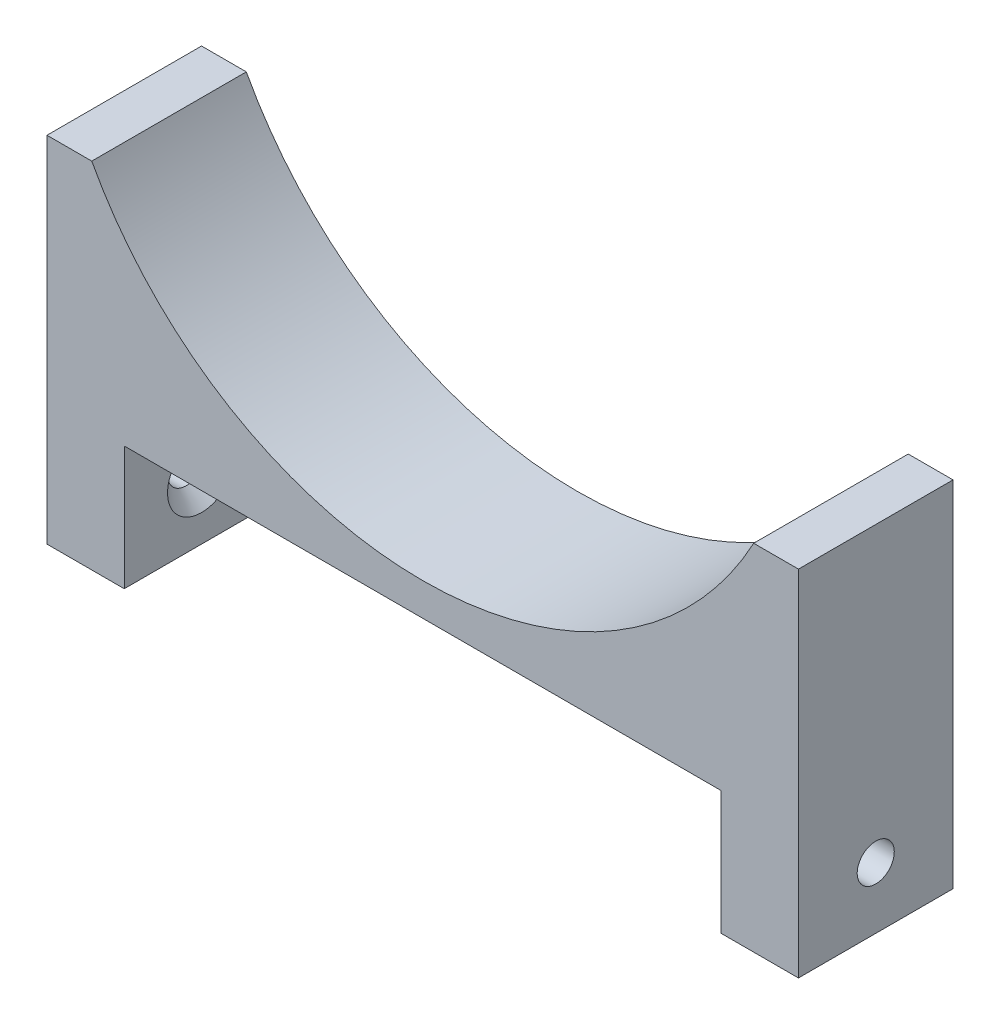
ISO-10303-21;
HEADER;
FILE_DESCRIPTION(('STEP AP214'),'2;1');
FILE_NAME('part.step','',(''),(''),'','','');
FILE_SCHEMA(('AUTOMOTIVE_DESIGN { 1 0 10303 214 1 1 1 1 }'));
ENDSEC;
DATA;
#1=APPLICATION_CONTEXT('core data for automotive mechanical design processes');
#2=APPLICATION_PROTOCOL_DEFINITION('international standard','automotive_design',2000,#1);
#3=PRODUCT_CONTEXT('',#1,'mechanical');
#4=PRODUCT('Part','Part','',(#3));
#5=PRODUCT_RELATED_PRODUCT_CATEGORY('part','',(#4));
#6=PRODUCT_DEFINITION_FORMATION('','',#4);
#7=PRODUCT_DEFINITION_CONTEXT('part definition',#1,'design');
#8=PRODUCT_DEFINITION('design','',#6,#7);
#9=PRODUCT_DEFINITION_SHAPE('','',#8);
#10=(LENGTH_UNIT() NAMED_UNIT(*) SI_UNIT(.MILLI.,.METRE.));
#11=(NAMED_UNIT(*) PLANE_ANGLE_UNIT() SI_UNIT($,.RADIAN.));
#12=(NAMED_UNIT(*) SI_UNIT($,.STERADIAN.) SOLID_ANGLE_UNIT());
#13=UNCERTAINTY_MEASURE_WITH_UNIT(LENGTH_MEASURE(1.E-05),#10,'distance_accuracy_value','');
#14=(GEOMETRIC_REPRESENTATION_CONTEXT(3) GLOBAL_UNCERTAINTY_ASSIGNED_CONTEXT((#13)) GLOBAL_UNIT_ASSIGNED_CONTEXT((#10,
#11,#12)) REPRESENTATION_CONTEXT('',''));
#15=CARTESIAN_POINT('',(0.,0.,0.));
#16=DIRECTION('',(0.,0.,1.));
#17=DIRECTION('',(1.,0.,0.));
#18=AXIS2_PLACEMENT_3D('',#15,#16,#17);
#19=CARTESIAN_POINT('',(0.,-13.2695636207256,10.));
#20=DIRECTION('',(0.,1.,0.));
#21=DIRECTION('',(0.,0.,1.));
#22=AXIS2_PLACEMENT_3D('',#19,#20,#21);
#23=PLANE('',#22);
#24=DIRECTION('',(1.,0.,0.));
#25=VECTOR('',#24,1.);
#26=CARTESIAN_POINT('',(0.,-13.2695636207256,0.));
#27=LINE('',#26,#25);
#28=CARTESIAN_POINT('',(-4.7093762726953,-13.2695636207256,0.));
#29=VERTEX_POINT('',#28);
#30=CARTESIAN_POINT('',(33.9106237273047,-13.2695636207256,0.));
#31=VERTEX_POINT('',#30);
#32=EDGE_CURVE('E161',#29,#31,#27,.T.);
#33=ORIENTED_EDGE('',*,*,#32,.T.);
#34=DIRECTION('',(0.,0.,-1.));
#35=VECTOR('',#34,1.);
#36=CARTESIAN_POINT('',(33.9106237273047,-13.2695636207256,10.));
#37=LINE('',#36,#35);
#38=CARTESIAN_POINT('',(33.9106237273047,-13.2695636207256,10.));
#39=VERTEX_POINT('',#38);
#40=EDGE_CURVE('E11',#39,#31,#37,.T.);
#41=ORIENTED_EDGE('',*,*,#40,.F.);
#42=DIRECTION('',(1.,0.,0.));
#43=VECTOR('',#42,1.);
#44=CARTESIAN_POINT('',(0.,-13.2695636207256,10.));
#45=LINE('',#44,#43);
#46=CARTESIAN_POINT('',(-4.7093762726953,-13.2695636207256,10.));
#47=VERTEX_POINT('',#46);
#48=EDGE_CURVE('E192',#47,#39,#45,.T.);
#49=ORIENTED_EDGE('',*,*,#48,.F.);
#50=DIRECTION('',(0.,0.,-1.));
#51=VECTOR('',#50,1.);
#52=CARTESIAN_POINT('',(-4.7093762726953,-13.2695636207256,10.));
#53=LINE('',#52,#51);
#54=EDGE_CURVE('E157',#47,#29,#53,.T.);
#55=ORIENTED_EDGE('',*,*,#54,.T.);
#56=EDGE_LOOP('',(#33,#41,#49,#55));
#57=FACE_BOUND('',#56,.T.);
#58=ADVANCED_FACE('F45',(#57),#23,.F.);
#59=CARTESIAN_POINT('',(33.9106237273047,0.,10.));
#60=DIRECTION('',(1.,0.,0.));
#61=DIRECTION('',(0.,1.,0.));
#62=AXIS2_PLACEMENT_3D('',#59,#60,#61);
#63=PLANE('',#62);
#64=CARTESIAN_POINT('',(33.9106237273047,-17.3014069741831,5.));
#65=DIRECTION('',(-1.,0.,0.));
#66=DIRECTION('',(0.,0.,1.));
#67=AXIS2_PLACEMENT_3D('',#64,#65,#66);
#68=CIRCLE('',#67,2.2);
#69=CARTESIAN_POINT('',(33.9106237273047,-17.3014069741831,7.2));
#70=VERTEX_POINT('',#69);
#71=EDGE_CURVE('E305',#70,#70,#68,.T.);
#72=ORIENTED_EDGE('',*,*,#71,.F.);
#73=EDGE_LOOP('',(#72));
#74=FACE_BOUND('',#73,.T.);
#75=DIRECTION('',(0.,-1.,0.));
#76=VECTOR('',#75,1.);
#77=CARTESIAN_POINT('',(33.9106237273047,0.,0.));
#78=LINE('',#77,#76);
#79=CARTESIAN_POINT('',(33.9106237273047,-21.2695636207256,0.));
#80=VERTEX_POINT('',#79);
#81=EDGE_CURVE('E165',#31,#80,#78,.T.);
#82=ORIENTED_EDGE('',*,*,#81,.T.);
#83=DIRECTION('',(0.,0.,-1.));
#84=VECTOR('',#83,1.);
#85=CARTESIAN_POINT('',(33.9106237273047,-21.2695636207256,10.));
#86=LINE('',#85,#84);
#87=CARTESIAN_POINT('',(33.9106237273047,-21.2695636207256,10.));
#88=VERTEX_POINT('',#87);
#89=EDGE_CURVE('E55',#88,#80,#86,.T.);
#90=ORIENTED_EDGE('',*,*,#89,.F.);
#91=DIRECTION('',(0.,-1.,0.));
#92=VECTOR('',#91,1.);
#93=CARTESIAN_POINT('',(33.9106237273047,0.,10.));
#94=LINE('',#93,#92);
#95=EDGE_CURVE('E113',#39,#88,#94,.T.);
#96=ORIENTED_EDGE('',*,*,#95,.F.);
#97=ORIENTED_EDGE('',*,*,#40,.T.);
#98=EDGE_LOOP('',(#82,#90,#96,#97));
#99=FACE_BOUND('',#98,.T.);
#100=ADVANCED_FACE('F274',(#74,#99),#63,.F.);
#101=CARTESIAN_POINT('',(0.,-21.2695636207256,10.));
#102=DIRECTION('',(0.,1.,0.));
#103=DIRECTION('',(0.,0.,1.));
#104=AXIS2_PLACEMENT_3D('',#101,#102,#103);
#105=PLANE('',#104);
#106=DIRECTION('',(1.,0.,0.));
#107=VECTOR('',#106,1.);
#108=CARTESIAN_POINT('',(0.,-21.2695636207256,0.));
#109=LINE('',#108,#107);
#110=CARTESIAN_POINT('',(38.9106237273047,-21.2695636207256,0.));
#111=VERTEX_POINT('',#110);
#112=EDGE_CURVE('E169',#80,#111,#109,.T.);
#113=ORIENTED_EDGE('',*,*,#112,.T.);
#114=DIRECTION('',(0.,0.,-1.));
#115=VECTOR('',#114,1.);
#116=CARTESIAN_POINT('',(38.9106237273047,-21.2695636207256,10.));
#117=LINE('',#116,#115);
#118=CARTESIAN_POINT('',(38.9106237273047,-21.2695636207256,10.));
#119=VERTEX_POINT('',#118);
#120=EDGE_CURVE('E209',#119,#111,#117,.T.);
#121=ORIENTED_EDGE('',*,*,#120,.F.);
#122=DIRECTION('',(1.,0.,0.));
#123=VECTOR('',#122,1.);
#124=CARTESIAN_POINT('',(0.,-21.2695636207256,10.));
#125=LINE('',#124,#123);
#126=EDGE_CURVE('E235',#88,#119,#125,.T.);
#127=ORIENTED_EDGE('',*,*,#126,.F.);
#128=ORIENTED_EDGE('',*,*,#89,.T.);
#129=EDGE_LOOP('',(#113,#121,#127,#128));
#130=FACE_BOUND('',#129,.T.);
#131=ADVANCED_FACE('F279',(#130),#105,.F.);
#132=CARTESIAN_POINT('',(38.9106237273047,0.,10.));
#133=DIRECTION('',(-1.,0.,0.));
#134=DIRECTION('',(0.,-1.,0.));
#135=AXIS2_PLACEMENT_3D('',#132,#133,#134);
#136=PLANE('',#135);
#137=CARTESIAN_POINT('',(38.9106237273047,-17.3014069741831,5.));
#138=DIRECTION('',(-1.,0.,0.));
#139=DIRECTION('',(0.,-1.,0.));
#140=AXIS2_PLACEMENT_3D('',#137,#138,#139);
#141=CIRCLE('',#140,1.19999999999999);
#142=CARTESIAN_POINT('',(38.9106237273047,-18.5014069741831,5.));
#143=VERTEX_POINT('',#142);
#144=EDGE_CURVE('E48',#143,#143,#141,.T.);
#145=ORIENTED_EDGE('',*,*,#144,.T.);
#146=EDGE_LOOP('',(#145));
#147=FACE_BOUND('',#146,.T.);
#148=DIRECTION('',(0.,1.,0.));
#149=VECTOR('',#148,1.);
#150=CARTESIAN_POINT('',(38.9106237273047,0.,0.));
#151=LINE('',#150,#149);
#152=CARTESIAN_POINT('',(38.9106237273047,1.64143290609947,0.));
#153=VERTEX_POINT('',#152);
#154=EDGE_CURVE('E172',#111,#153,#151,.T.);
#155=ORIENTED_EDGE('',*,*,#154,.T.);
#156=DIRECTION('',(0.,0.,-1.));
#157=VECTOR('',#156,1.);
#158=CARTESIAN_POINT('',(38.9106237273047,1.64143290609947,10.));
#159=LINE('',#158,#157);
#160=CARTESIAN_POINT('',(38.9106237273047,1.64143290609947,10.));
#161=VERTEX_POINT('',#160);
#162=EDGE_CURVE('E205',#161,#153,#159,.T.);
#163=ORIENTED_EDGE('',*,*,#162,.F.);
#164=DIRECTION('',(0.,1.,0.));
#165=VECTOR('',#164,1.);
#166=CARTESIAN_POINT('',(38.9106237273047,0.,10.));
#167=LINE('',#166,#165);
#168=EDGE_CURVE('E238',#119,#161,#167,.T.);
#169=ORIENTED_EDGE('',*,*,#168,.F.);
#170=ORIENTED_EDGE('',*,*,#120,.T.);
#171=EDGE_LOOP('',(#155,#163,#169,#170));
#172=FACE_BOUND('',#171,.T.);
#173=ADVANCED_FACE('F288',(#147,#172),#136,.F.);
#174=CARTESIAN_POINT('',(0.,1.64143290609946,10.));
#175=DIRECTION('',(0.,-1.,0.));
#176=DIRECTION('',(1.,0.,0.));
#177=AXIS2_PLACEMENT_3D('',#174,#175,#176);
#178=PLANE('',#177);
#179=DIRECTION('',(-1.,0.,0.));
#180=VECTOR('',#179,1.);
#181=CARTESIAN_POINT('',(0.,1.64143290609946,0.));
#182=LINE('',#181,#180);
#183=CARTESIAN_POINT('',(36.0136790687184,1.64143290609947,0.));
#184=VERTEX_POINT('',#183);
#185=EDGE_CURVE('E175',#153,#184,#182,.T.);
#186=ORIENTED_EDGE('',*,*,#185,.T.);
#187=DIRECTION('',(0.,0.,-1.));
#188=VECTOR('',#187,1.);
#189=CARTESIAN_POINT('',(36.0136790687184,1.64143290609947,10.));
#190=LINE('',#189,#188);
#191=CARTESIAN_POINT('',(36.0136790687184,1.64143290609947,10.));
#192=VERTEX_POINT('',#191);
#193=EDGE_CURVE('E202',#192,#184,#190,.T.);
#194=ORIENTED_EDGE('',*,*,#193,.F.);
#195=DIRECTION('',(-1.,0.,0.));
#196=VECTOR('',#195,1.);
#197=CARTESIAN_POINT('',(0.,1.64143290609946,10.));
#198=LINE('',#197,#196);
#199=EDGE_CURVE('E241',#161,#192,#198,.T.);
#200=ORIENTED_EDGE('',*,*,#199,.F.);
#201=ORIENTED_EDGE('',*,*,#162,.T.);
#202=EDGE_LOOP('',(#186,#194,#200,#201));
#203=FACE_BOUND('',#202,.T.);
#204=ADVANCED_FACE('F256',(#203),#178,.F.);
#205=CARTESIAN_POINT('',(14.6006237273047,13.1504363792744,10.));
#206=DIRECTION('',(0.,0.,-1.));
#207=DIRECTION('',(-1.,0.,0.));
#208=AXIS2_PLACEMENT_3D('',#205,#206,#207);
#209=CYLINDRICAL_SURFACE('',#208,24.31);
#210=CARTESIAN_POINT('',(14.6006237273047,13.1504363792744,0.));
#211=DIRECTION('',(0.,0.,1.));
#212=DIRECTION('',(1.,0.,0.));
#213=AXIS2_PLACEMENT_3D('',#210,#211,#212);
#214=CIRCLE('',#213,24.31);
#215=CARTESIAN_POINT('',(-6.81243161410905,1.64143290609946,0.));
#216=VERTEX_POINT('',#215);
#217=EDGE_CURVE('E179',#216,#184,#214,.T.);
#218=ORIENTED_EDGE('',*,*,#217,.F.);
#219=DIRECTION('',(0.,0.,-1.));
#220=VECTOR('',#219,1.);
#221=CARTESIAN_POINT('',(-6.81243161410905,1.64143290609946,10.));
#222=LINE('',#221,#220);
#223=CARTESIAN_POINT('',(-6.81243161410905,1.64143290609946,10.));
#224=VERTEX_POINT('',#223);
#225=EDGE_CURVE('E199',#224,#216,#222,.T.);
#226=ORIENTED_EDGE('',*,*,#225,.F.);
#227=CARTESIAN_POINT('',(14.6006237273047,13.1504363792744,10.));
#228=DIRECTION('',(0.,0.,1.));
#229=DIRECTION('',(1.,0.,0.));
#230=AXIS2_PLACEMENT_3D('',#227,#228,#229);
#231=CIRCLE('',#230,24.31);
#232=EDGE_CURVE('E244',#224,#192,#231,.T.);
#233=ORIENTED_EDGE('',*,*,#232,.T.);
#234=ORIENTED_EDGE('',*,*,#193,.T.);
#235=EDGE_LOOP('',(#218,#226,#233,#234));
#236=FACE_BOUND('',#235,.T.);
#237=ADVANCED_FACE('F250',(#236),#209,.F.);
#238=CARTESIAN_POINT('',(0.,1.64143290609946,10.));
#239=DIRECTION('',(0.,-1.,0.));
#240=DIRECTION('',(1.,0.,0.));
#241=AXIS2_PLACEMENT_3D('',#238,#239,#240);
#242=PLANE('',#241);
#243=DIRECTION('',(-1.,0.,0.));
#244=VECTOR('',#243,1.);
#245=CARTESIAN_POINT('',(0.,1.64143290609946,0.));
#246=LINE('',#245,#244);
#247=CARTESIAN_POINT('',(-9.7093762726953,1.64143290609946,0.));
#248=VERTEX_POINT('',#247);
#249=EDGE_CURVE('E183',#216,#248,#246,.T.);
#250=ORIENTED_EDGE('',*,*,#249,.T.);
#251=DIRECTION('',(0.,0.,-1.));
#252=VECTOR('',#251,1.);
#253=CARTESIAN_POINT('',(-9.7093762726953,1.64143290609946,10.));
#254=LINE('',#253,#252);
#255=CARTESIAN_POINT('',(-9.7093762726953,1.64143290609946,10.));
#256=VERTEX_POINT('',#255);
#257=EDGE_CURVE('E150',#256,#248,#254,.T.);
#258=ORIENTED_EDGE('',*,*,#257,.F.);
#259=DIRECTION('',(-1.,0.,0.));
#260=VECTOR('',#259,1.);
#261=CARTESIAN_POINT('',(0.,1.64143290609946,10.));
#262=LINE('',#261,#260);
#263=EDGE_CURVE('E139',#224,#256,#262,.T.);
#264=ORIENTED_EDGE('',*,*,#263,.F.);
#265=ORIENTED_EDGE('',*,*,#225,.T.);
#266=EDGE_LOOP('',(#250,#258,#264,#265));
#267=FACE_BOUND('',#266,.T.);
#268=ADVANCED_FACE('F264',(#267),#242,.F.);
#269=CARTESIAN_POINT('',(-9.7093762726953,0.,10.));
#270=DIRECTION('',(1.,0.,0.));
#271=DIRECTION('',(0.,1.,0.));
#272=AXIS2_PLACEMENT_3D('',#269,#270,#271);
#273=PLANE('',#272);
#274=CARTESIAN_POINT('',(-9.7093762726953,-17.3014069741831,5.));
#275=DIRECTION('',(1.,0.,0.));
#276=DIRECTION('',(0.,1.,0.));
#277=AXIS2_PLACEMENT_3D('',#274,#275,#276);
#278=CIRCLE('',#277,1.19999999999999);
#279=CARTESIAN_POINT('',(-9.7093762726953,-16.1014069741831,5.));
#280=VERTEX_POINT('',#279);
#281=EDGE_CURVE('E166',#280,#280,#278,.T.);
#282=ORIENTED_EDGE('',*,*,#281,.T.);
#283=EDGE_LOOP('',(#282));
#284=FACE_BOUND('',#283,.T.);
#285=DIRECTION('',(0.,-1.,0.));
#286=VECTOR('',#285,1.);
#287=CARTESIAN_POINT('',(-9.7093762726953,0.,0.));
#288=LINE('',#287,#286);
#289=CARTESIAN_POINT('',(-9.7093762726953,-21.2695636207256,0.));
#290=VERTEX_POINT('',#289);
#291=EDGE_CURVE('E148',#248,#290,#288,.T.);
#292=ORIENTED_EDGE('',*,*,#291,.T.);
#293=DIRECTION('',(0.,0.,-1.));
#294=VECTOR('',#293,1.);
#295=CARTESIAN_POINT('',(-9.7093762726953,-21.2695636207256,10.));
#296=LINE('',#295,#294);
#297=CARTESIAN_POINT('',(-9.7093762726953,-21.2695636207256,10.));
#298=VERTEX_POINT('',#297);
#299=EDGE_CURVE('E145',#298,#290,#296,.T.);
#300=ORIENTED_EDGE('',*,*,#299,.F.);
#301=DIRECTION('',(0.,-1.,0.));
#302=VECTOR('',#301,1.);
#303=CARTESIAN_POINT('',(-9.7093762726953,0.,10.));
#304=LINE('',#303,#302);
#305=EDGE_CURVE('E132',#256,#298,#304,.T.);
#306=ORIENTED_EDGE('',*,*,#305,.F.);
#307=ORIENTED_EDGE('',*,*,#257,.T.);
#308=EDGE_LOOP('',(#292,#300,#306,#307));
#309=FACE_BOUND('',#308,.T.);
#310=ADVANCED_FACE('F146',(#284,#309),#273,.F.);
#311=CARTESIAN_POINT('',(0.,-21.2695636207256,10.));
#312=DIRECTION('',(0.,1.,0.));
#313=DIRECTION('',(0.,0.,1.));
#314=AXIS2_PLACEMENT_3D('',#311,#312,#313);
#315=PLANE('',#314);
#316=DIRECTION('',(1.,0.,0.));
#317=VECTOR('',#316,1.);
#318=CARTESIAN_POINT('',(0.,-21.2695636207256,0.));
#319=LINE('',#318,#317);
#320=CARTESIAN_POINT('',(-4.7093762726953,-21.2695636207256,0.));
#321=VERTEX_POINT('',#320);
#322=EDGE_CURVE('E99',#290,#321,#319,.T.);
#323=ORIENTED_EDGE('',*,*,#322,.T.);
#324=DIRECTION('',(0.,0.,-1.));
#325=VECTOR('',#324,1.);
#326=CARTESIAN_POINT('',(-4.7093762726953,-21.2695636207256,10.));
#327=LINE('',#326,#325);
#328=CARTESIAN_POINT('',(-4.7093762726953,-21.2695636207256,10.));
#329=VERTEX_POINT('',#328);
#330=EDGE_CURVE('E151',#329,#321,#327,.T.);
#331=ORIENTED_EDGE('',*,*,#330,.F.);
#332=DIRECTION('',(1.,0.,0.));
#333=VECTOR('',#332,1.);
#334=CARTESIAN_POINT('',(0.,-21.2695636207256,10.));
#335=LINE('',#334,#333);
#336=EDGE_CURVE('E136',#298,#329,#335,.T.);
#337=ORIENTED_EDGE('',*,*,#336,.F.);
#338=ORIENTED_EDGE('',*,*,#299,.T.);
#339=EDGE_LOOP('',(#323,#331,#337,#338));
#340=FACE_BOUND('',#339,.T.);
#341=ADVANCED_FACE('F153',(#340),#315,.F.);
#342=CARTESIAN_POINT('',(-4.7093762726953,0.,10.));
#343=DIRECTION('',(-1.,0.,0.));
#344=DIRECTION('',(0.,0.,1.));
#345=AXIS2_PLACEMENT_3D('',#342,#343,#344);
#346=PLANE('',#345);
#347=CARTESIAN_POINT('',(-4.7093762726953,-17.3014069741831,5.));
#348=DIRECTION('',(1.,0.,0.));
#349=DIRECTION('',(0.,0.,-1.));
#350=AXIS2_PLACEMENT_3D('',#347,#348,#349);
#351=CIRCLE('',#350,2.2);
#352=CARTESIAN_POINT('',(-4.7093762726953,-17.3014069741831,2.8));
#353=VERTEX_POINT('',#352);
#354=EDGE_CURVE('E222',#353,#353,#351,.T.);
#355=ORIENTED_EDGE('',*,*,#354,.F.);
#356=EDGE_LOOP('',(#355));
#357=FACE_BOUND('',#356,.T.);
#358=DIRECTION('',(0.,1.,0.));
#359=VECTOR('',#358,1.);
#360=CARTESIAN_POINT('',(-4.7093762726953,0.,0.));
#361=LINE('',#360,#359);
#362=EDGE_CURVE('E105',#321,#29,#361,.T.);
#363=ORIENTED_EDGE('',*,*,#362,.T.);
#364=ORIENTED_EDGE('',*,*,#54,.F.);
#365=DIRECTION('',(0.,1.,0.));
#366=VECTOR('',#365,1.);
#367=CARTESIAN_POINT('',(-4.7093762726953,0.,10.));
#368=LINE('',#367,#366);
#369=EDGE_CURVE('E64',#329,#47,#368,.T.);
#370=ORIENTED_EDGE('',*,*,#369,.F.);
#371=ORIENTED_EDGE('',*,*,#330,.T.);
#372=EDGE_LOOP('',(#363,#364,#370,#371));
#373=FACE_BOUND('',#372,.T.);
#374=ADVANCED_FACE('F332',(#357,#373),#346,.F.);
#375=CARTESIAN_POINT('',(0.,0.,10.));
#376=DIRECTION('',(0.,0.,1.));
#377=DIRECTION('',(1.,0.,0.));
#378=AXIS2_PLACEMENT_3D('',#375,#376,#377);
#379=PLANE('',#378);
#380=ORIENTED_EDGE('',*,*,#48,.T.);
#381=ORIENTED_EDGE('',*,*,#95,.T.);
#382=ORIENTED_EDGE('',*,*,#126,.T.);
#383=ORIENTED_EDGE('',*,*,#168,.T.);
#384=ORIENTED_EDGE('',*,*,#199,.T.);
#385=ORIENTED_EDGE('',*,*,#232,.F.);
#386=ORIENTED_EDGE('',*,*,#263,.T.);
#387=ORIENTED_EDGE('',*,*,#305,.T.);
#388=ORIENTED_EDGE('',*,*,#336,.T.);
#389=ORIENTED_EDGE('',*,*,#369,.T.);
#390=EDGE_LOOP('',(#380,#381,#382,#383,#384,#385,#386,#387,#388,#389));
#391=FACE_BOUND('',#390,.T.);
#392=ADVANCED_FACE('F134',(#391),#379,.T.);
#393=CARTESIAN_POINT('',(0.,0.,0.));
#394=DIRECTION('',(0.,0.,1.));
#395=DIRECTION('',(1.,0.,0.));
#396=AXIS2_PLACEMENT_3D('',#393,#394,#395);
#397=PLANE('',#396);
#398=ORIENTED_EDGE('',*,*,#32,.F.);
#399=ORIENTED_EDGE('',*,*,#362,.F.);
#400=ORIENTED_EDGE('',*,*,#322,.F.);
#401=ORIENTED_EDGE('',*,*,#291,.F.);
#402=ORIENTED_EDGE('',*,*,#249,.F.);
#403=ORIENTED_EDGE('',*,*,#217,.T.);
#404=ORIENTED_EDGE('',*,*,#185,.F.);
#405=ORIENTED_EDGE('',*,*,#154,.F.);
#406=ORIENTED_EDGE('',*,*,#112,.F.);
#407=ORIENTED_EDGE('',*,*,#81,.F.);
#408=EDGE_LOOP('',(#398,#399,#400,#401,#402,#403,#404,#405,#406,#407));
#409=FACE_BOUND('',#408,.T.);
#410=ADVANCED_FACE('F262',(#409),#397,.F.);
#411=CARTESIAN_POINT('',(-4.7093762726953,-17.3014069741831,5.));
#412=DIRECTION('',(1.,0.,0.));
#413=DIRECTION('',(0.,0.,-1.));
#414=AXIS2_PLACEMENT_3D('',#411,#412,#413);
#415=CYLINDRICAL_SURFACE('',#414,1.19999999999999);
#416=CARTESIAN_POINT('',(-5.7093762726953,-17.3014069741831,5.));
#417=DIRECTION('',(1.,0.,0.));
#418=DIRECTION('',(0.,0.,-1.));
#419=AXIS2_PLACEMENT_3D('',#416,#417,#418);
#420=CIRCLE('',#419,1.19999999999999);
#421=CARTESIAN_POINT('',(-5.7093762726953,-17.3014069741831,3.80000000000001));
#422=VERTEX_POINT('',#421);
#423=EDGE_CURVE('E217',#422,#422,#420,.T.);
#424=ORIENTED_EDGE('',*,*,#423,.T.);
#425=EDGE_LOOP('',(#424));
#426=FACE_BOUND('',#425,.T.);
#427=ORIENTED_EDGE('',*,*,#281,.F.);
#428=EDGE_LOOP('',(#427));
#429=FACE_BOUND('',#428,.T.);
#430=ADVANCED_FACE('F326',(#426,#429),#415,.F.);
#431=CARTESIAN_POINT('',(-4.7093762726953,-17.3014069741831,5.));
#432=DIRECTION('',(1.,0.,0.));
#433=DIRECTION('',(0.,0.,-1.));
#434=AXIS2_PLACEMENT_3D('',#431,#432,#433);
#435=CONICAL_SURFACE('',#434,2.2,0.785398163397453);
#436=ORIENTED_EDGE('',*,*,#423,.F.);
#437=EDGE_LOOP('',(#436));
#438=FACE_BOUND('',#437,.T.);
#439=ORIENTED_EDGE('',*,*,#354,.T.);
#440=EDGE_LOOP('',(#439));
#441=FACE_BOUND('',#440,.T.);
#442=ADVANCED_FACE('F321',(#438,#441),#435,.F.);
#443=CARTESIAN_POINT('',(33.9106237273047,-17.3014069741831,5.));
#444=DIRECTION('',(-1.,0.,0.));
#445=DIRECTION('',(0.,0.,1.));
#446=AXIS2_PLACEMENT_3D('',#443,#444,#445);
#447=CYLINDRICAL_SURFACE('',#446,1.19999999999999);
#448=CARTESIAN_POINT('',(34.9106237273047,-17.3014069741831,5.));
#449=DIRECTION('',(-1.,0.,0.));
#450=DIRECTION('',(0.,0.,1.));
#451=AXIS2_PLACEMENT_3D('',#448,#449,#450);
#452=CIRCLE('',#451,1.19999999999999);
#453=CARTESIAN_POINT('',(34.9106237273047,-17.3014069741831,6.19999999999999));
#454=VERTEX_POINT('',#453);
#455=EDGE_CURVE('E302',#454,#454,#452,.T.);
#456=ORIENTED_EDGE('',*,*,#455,.T.);
#457=EDGE_LOOP('',(#456));
#458=FACE_BOUND('',#457,.T.);
#459=ORIENTED_EDGE('',*,*,#144,.F.);
#460=EDGE_LOOP('',(#459));
#461=FACE_BOUND('',#460,.T.);
#462=ADVANCED_FACE('F315',(#458,#461),#447,.F.);
#463=CARTESIAN_POINT('',(33.9106237273047,-17.3014069741831,5.));
#464=DIRECTION('',(-1.,0.,0.));
#465=DIRECTION('',(0.,0.,1.));
#466=AXIS2_PLACEMENT_3D('',#463,#464,#465);
#467=CONICAL_SURFACE('',#466,2.2,0.785398163397453);
#468=ORIENTED_EDGE('',*,*,#455,.F.);
#469=EDGE_LOOP('',(#468));
#470=FACE_BOUND('',#469,.T.);
#471=ORIENTED_EDGE('',*,*,#71,.T.);
#472=EDGE_LOOP('',(#471));
#473=FACE_BOUND('',#472,.T.);
#474=ADVANCED_FACE('F313',(#470,#473),#467,.F.);
#475=CLOSED_SHELL('',(#58,#100,#131,#173,#204,#237,#268,#310,#341,#374,#392,#410,#430,#442,#462,#474));
#476=MANIFOLD_SOLID_BREP('B2',#475);
#477=ADVANCED_BREP_SHAPE_REPRESENTATION('',(#18,#476),#14);
#478=SHAPE_DEFINITION_REPRESENTATION(#9,#477);
ENDSEC;
END-ISO-10303-21;
